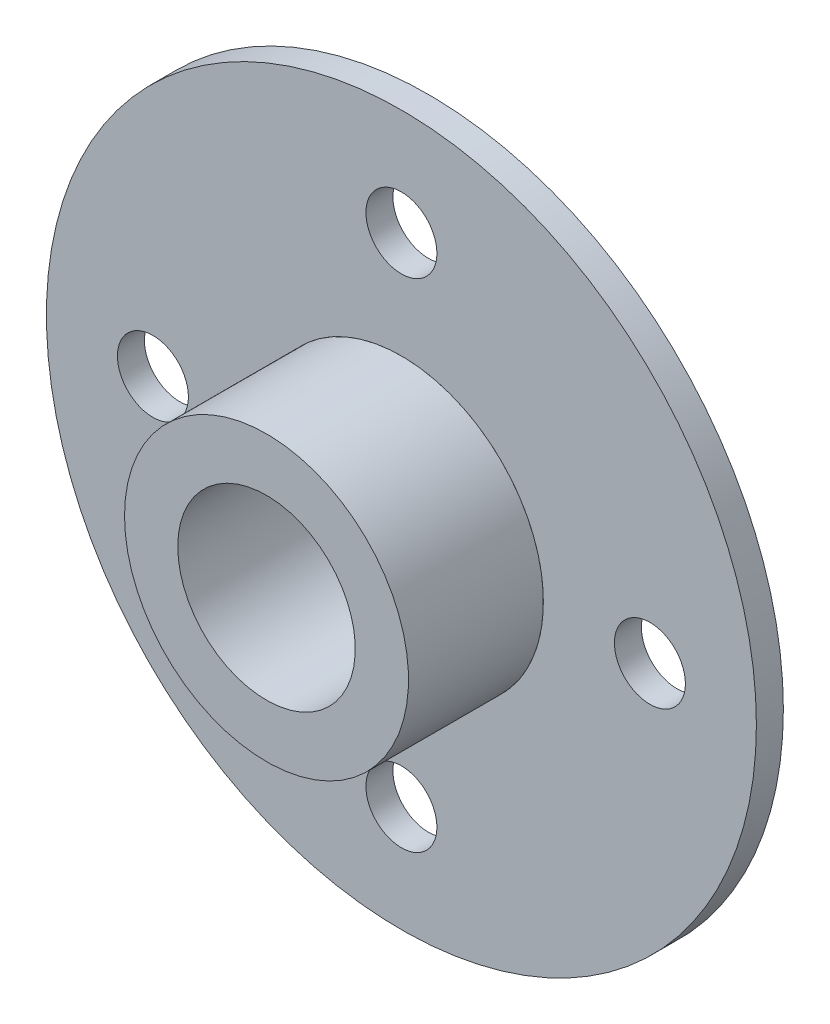
ISO-10303-21;
HEADER;
FILE_DESCRIPTION(('STEP AP214'),'2;1');
FILE_NAME('part.step','',(''),(''),'','','');
FILE_SCHEMA(('AUTOMOTIVE_DESIGN { 1 0 10303 214 1 1 1 1 }'));
ENDSEC;
DATA;
#1=APPLICATION_CONTEXT('core data for automotive mechanical design processes');
#2=APPLICATION_PROTOCOL_DEFINITION('international standard','automotive_design',2000,#1);
#3=PRODUCT_CONTEXT('',#1,'mechanical');
#4=PRODUCT('Part','Part','',(#3));
#5=PRODUCT_RELATED_PRODUCT_CATEGORY('part','',(#4));
#6=PRODUCT_DEFINITION_FORMATION('','',#4);
#7=PRODUCT_DEFINITION_CONTEXT('part definition',#1,'design');
#8=PRODUCT_DEFINITION('design','',#6,#7);
#9=PRODUCT_DEFINITION_SHAPE('','',#8);
#10=(LENGTH_UNIT() NAMED_UNIT(*) SI_UNIT(.MILLI.,.METRE.));
#11=(NAMED_UNIT(*) PLANE_ANGLE_UNIT() SI_UNIT($,.RADIAN.));
#12=(NAMED_UNIT(*) SI_UNIT($,.STERADIAN.) SOLID_ANGLE_UNIT());
#13=UNCERTAINTY_MEASURE_WITH_UNIT(LENGTH_MEASURE(1.E-05),#10,'distance_accuracy_value','');
#14=(GEOMETRIC_REPRESENTATION_CONTEXT(3) GLOBAL_UNCERTAINTY_ASSIGNED_CONTEXT((#13)) GLOBAL_UNIT_ASSIGNED_CONTEXT((#10,
#11,#12)) REPRESENTATION_CONTEXT('',''));
#15=CARTESIAN_POINT('',(0.,0.,0.));
#16=DIRECTION('',(0.,0.,1.));
#17=DIRECTION('',(1.,0.,0.));
#18=AXIS2_PLACEMENT_3D('',#15,#16,#17);
#19=CARTESIAN_POINT('',(0.,0.,4.56));
#20=DIRECTION('',(0.,0.,1.));
#21=DIRECTION('',(1.,0.,0.));
#22=AXIS2_PLACEMENT_3D('',#19,#20,#21);
#23=PLANE('',#22);
#24=CARTESIAN_POINT('',(0.,0.,4.56));
#25=DIRECTION('',(0.,0.,1.));
#26=DIRECTION('',(1.,0.,0.));
#27=AXIS2_PLACEMENT_3D('',#24,#25,#26);
#28=CIRCLE('',#27,4.);
#29=CARTESIAN_POINT('',(-4.,0.,4.56));
#30=VERTEX_POINT('',#29);
#31=EDGE_CURVE('E11',#30,#30,#28,.T.);
#32=ORIENTED_EDGE('',*,*,#31,.T.);
#33=EDGE_LOOP('',(#32));
#34=FACE_BOUND('',#33,.T.);
#35=CARTESIAN_POINT('',(0.,0.,4.56));
#36=DIRECTION('',(0.,0.,1.));
#37=DIRECTION('',(1.,0.,0.));
#38=AXIS2_PLACEMENT_3D('',#35,#36,#37);
#39=CIRCLE('',#38,2.5);
#40=CARTESIAN_POINT('',(-2.5,0.,4.56));
#41=VERTEX_POINT('',#40);
#42=EDGE_CURVE('E53',#41,#41,#39,.T.);
#43=ORIENTED_EDGE('',*,*,#42,.F.);
#44=EDGE_LOOP('',(#43));
#45=FACE_BOUND('',#44,.T.);
#46=ADVANCED_FACE('F42',(#34,#45),#23,.T.);
#47=CARTESIAN_POINT('',(0.,0.,0.76));
#48=DIRECTION('',(0.,0.,1.));
#49=DIRECTION('',(1.,0.,0.));
#50=AXIS2_PLACEMENT_3D('',#47,#48,#49);
#51=PLANE('',#50);
#52=CARTESIAN_POINT('',(0.,0.,0.76));
#53=DIRECTION('',(0.,0.,1.));
#54=DIRECTION('',(1.,0.,0.));
#55=AXIS2_PLACEMENT_3D('',#52,#53,#54);
#56=CIRCLE('',#55,4.);
#57=CARTESIAN_POINT('',(-4.,0.,0.76));
#58=VERTEX_POINT('',#57);
#59=EDGE_CURVE('E46',#58,#58,#56,.T.);
#60=ORIENTED_EDGE('',*,*,#59,.F.);
#61=EDGE_LOOP('',(#60));
#62=FACE_BOUND('',#61,.T.);
#63=CARTESIAN_POINT('',(0.,0.,0.76));
#64=DIRECTION('',(0.,0.,1.));
#65=DIRECTION('',(1.,0.,0.));
#66=AXIS2_PLACEMENT_3D('',#63,#64,#65);
#67=CIRCLE('',#66,2.5);
#68=CARTESIAN_POINT('',(-2.5,0.,0.76));
#69=VERTEX_POINT('',#68);
#70=EDGE_CURVE('E55',#69,#69,#67,.T.);
#71=ORIENTED_EDGE('',*,*,#70,.T.);
#72=EDGE_LOOP('',(#71));
#73=FACE_BOUND('',#72,.T.);
#74=ADVANCED_FACE('F65',(#62,#73),#51,.F.);
#75=CARTESIAN_POINT('',(0.,0.,4.56));
#76=DIRECTION('',(0.,0.,-1.));
#77=DIRECTION('',(-1.,0.,0.));
#78=AXIS2_PLACEMENT_3D('',#75,#76,#77);
#79=CYLINDRICAL_SURFACE('',#78,4.);
#80=CARTESIAN_POINT('',(-4.,0.,4.56));
#81=CARTESIAN_POINT('',(-4.,0.,4.52041666666667));
#82=CARTESIAN_POINT('',(-4.,0.,4.48083333333333));
#83=CARTESIAN_POINT('',(-4.,0.,4.40166666666667));
#84=CARTESIAN_POINT('',(-4.,0.,4.36208333333333));
#85=CARTESIAN_POINT('',(-4.,0.,4.28291666666667));
#86=CARTESIAN_POINT('',(-4.,0.,4.24333333333333));
#87=CARTESIAN_POINT('',(-4.,0.,4.16416666666667));
#88=CARTESIAN_POINT('',(-4.,0.,4.12458333333333));
#89=CARTESIAN_POINT('',(-4.,0.,4.04541666666667));
#90=CARTESIAN_POINT('',(-4.,0.,4.00583333333333));
#91=CARTESIAN_POINT('',(-4.,0.,3.92666666666667));
#92=CARTESIAN_POINT('',(-4.,0.,3.88708333333333));
#93=CARTESIAN_POINT('',(-4.,0.,3.80791666666667));
#94=CARTESIAN_POINT('',(-4.,0.,3.76833333333333));
#95=CARTESIAN_POINT('',(-4.,0.,3.68916666666667));
#96=CARTESIAN_POINT('',(-4.,0.,3.64958333333333));
#97=CARTESIAN_POINT('',(-4.,0.,3.57041666666667));
#98=CARTESIAN_POINT('',(-4.,0.,3.53083333333333));
#99=CARTESIAN_POINT('',(-4.,0.,3.45166666666667));
#100=CARTESIAN_POINT('',(-4.,0.,3.41208333333333));
#101=CARTESIAN_POINT('',(-4.,0.,3.33291666666667));
#102=CARTESIAN_POINT('',(-4.,0.,3.29333333333333));
#103=CARTESIAN_POINT('',(-4.,0.,3.21416666666667));
#104=CARTESIAN_POINT('',(-4.,0.,3.17458333333333));
#105=CARTESIAN_POINT('',(-4.,0.,3.09541666666667));
#106=CARTESIAN_POINT('',(-4.,0.,3.05583333333333));
#107=CARTESIAN_POINT('',(-4.,0.,2.97666666666667));
#108=CARTESIAN_POINT('',(-4.,0.,2.93708333333333));
#109=CARTESIAN_POINT('',(-4.,0.,2.85791666666667));
#110=CARTESIAN_POINT('',(-4.,0.,2.81833333333333));
#111=CARTESIAN_POINT('',(-4.,0.,2.73916666666667));
#112=CARTESIAN_POINT('',(-4.,0.,2.69958333333333));
#113=CARTESIAN_POINT('',(-4.,0.,2.62041666666667));
#114=CARTESIAN_POINT('',(-4.,0.,2.58083333333333));
#115=CARTESIAN_POINT('',(-4.,0.,2.50166666666667));
#116=CARTESIAN_POINT('',(-4.,0.,2.46208333333333));
#117=CARTESIAN_POINT('',(-4.,0.,2.38291666666667));
#118=CARTESIAN_POINT('',(-4.,0.,2.34333333333333));
#119=CARTESIAN_POINT('',(-4.,0.,2.26416666666667));
#120=CARTESIAN_POINT('',(-4.,0.,2.22458333333333));
#121=CARTESIAN_POINT('',(-4.,0.,2.14541666666667));
#122=CARTESIAN_POINT('',(-4.,0.,2.10583333333333));
#123=CARTESIAN_POINT('',(-4.,0.,2.02666666666667));
#124=CARTESIAN_POINT('',(-4.,0.,1.98708333333333));
#125=CARTESIAN_POINT('',(-4.,0.,1.90791666666667));
#126=CARTESIAN_POINT('',(-4.,0.,1.86833333333333));
#127=CARTESIAN_POINT('',(-4.,0.,1.78916666666667));
#128=CARTESIAN_POINT('',(-4.,0.,1.74958333333333));
#129=CARTESIAN_POINT('',(-4.,0.,1.67041666666667));
#130=CARTESIAN_POINT('',(-4.,0.,1.63083333333333));
#131=CARTESIAN_POINT('',(-4.,0.,1.55166666666667));
#132=CARTESIAN_POINT('',(-4.,0.,1.51208333333333));
#133=CARTESIAN_POINT('',(-4.,0.,1.43291666666667));
#134=CARTESIAN_POINT('',(-4.,0.,1.39333333333333));
#135=CARTESIAN_POINT('',(-4.,0.,1.31416666666667));
#136=CARTESIAN_POINT('',(-4.,0.,1.27458333333333));
#137=CARTESIAN_POINT('',(-4.,0.,1.19541666666667));
#138=CARTESIAN_POINT('',(-4.,0.,1.15583333333333));
#139=CARTESIAN_POINT('',(-4.,0.,1.07666666666667));
#140=CARTESIAN_POINT('',(-4.,0.,1.03708333333333));
#141=CARTESIAN_POINT('',(-4.,0.,0.957916666666666));
#142=CARTESIAN_POINT('',(-4.,0.,0.918333333333333));
#143=CARTESIAN_POINT('',(-4.,0.,0.839166666666666));
#144=CARTESIAN_POINT('',(-4.,0.,0.799583333333333));
#145=CARTESIAN_POINT('',(-4.,0.,0.76));
#146=B_SPLINE_CURVE_WITH_KNOTS('',3,(#80,#81,#82,#83,#84,#85,#86,#87,#88,#89,#90,#91,#92,#93,
#94,#95,#96,#97,#98,#99,#100,#101,#102,#103,#104,#105,#106,#107,#108,#109,#110,#111,#112,#113,
#114,#115,#116,#117,#118,#119,#120,#121,#122,#123,#124,#125,#126,#127,#128,#129,#130,#131,#132,
#133,#134,#135,#136,#137,#138,#139,#140,#141,#142,#143,#144,#145),.UNSPECIFIED.,.F.,.F.,(4,2,2,
2,2,2,2,2,2,2,2,2,2,2,2,2,2,2,2,2,2,2,2,2,2,2,2,2,2,2,2,2,4),(0.,0.11875,0.2375,0.35625,0.475,
0.59375,0.7125,0.831249999999999,0.95,1.06875,1.1875,1.30625,1.425,1.54375,1.6625,1.78125,1.9,
2.01875,2.1375,2.25625,2.375,2.49375,2.6125,2.73125,2.85,2.96875,3.0875,3.20625,3.325,3.44375,
3.5625,3.68125,3.8),.UNSPECIFIED.);
#147=EDGE_CURVE('BSEAM44',#30,#58,#146,.T.);
#148=ORIENTED_EDGE('',*,*,#31,.F.);
#149=ORIENTED_EDGE('',*,*,#59,.T.);
#150=ORIENTED_EDGE('',*,*,#147,.T.);
#151=ORIENTED_EDGE('',*,*,#147,.F.);
#152=EDGE_LOOP('',(#148,#150,#149,#151));
#153=FACE_BOUND('',#152,.T.);
#154=ADVANCED_FACE('F44',(#153),#79,.T.);
#155=CARTESIAN_POINT('',(0.,0.,4.56));
#156=DIRECTION('',(0.,0.,-1.));
#157=DIRECTION('',(-1.,0.,0.));
#158=AXIS2_PLACEMENT_3D('',#155,#156,#157);
#159=CYLINDRICAL_SURFACE('',#158,2.5);
#160=CARTESIAN_POINT('',(-2.5,0.,4.56));
#161=CARTESIAN_POINT('',(-2.5,0.,4.52041666666667));
#162=CARTESIAN_POINT('',(-2.5,0.,4.48083333333333));
#163=CARTESIAN_POINT('',(-2.5,0.,4.40166666666667));
#164=CARTESIAN_POINT('',(-2.5,0.,4.36208333333333));
#165=CARTESIAN_POINT('',(-2.5,0.,4.28291666666667));
#166=CARTESIAN_POINT('',(-2.5,0.,4.24333333333333));
#167=CARTESIAN_POINT('',(-2.5,0.,4.16416666666667));
#168=CARTESIAN_POINT('',(-2.5,0.,4.12458333333333));
#169=CARTESIAN_POINT('',(-2.5,0.,4.04541666666667));
#170=CARTESIAN_POINT('',(-2.5,0.,4.00583333333333));
#171=CARTESIAN_POINT('',(-2.5,0.,3.92666666666667));
#172=CARTESIAN_POINT('',(-2.5,0.,3.88708333333333));
#173=CARTESIAN_POINT('',(-2.5,0.,3.80791666666667));
#174=CARTESIAN_POINT('',(-2.5,0.,3.76833333333333));
#175=CARTESIAN_POINT('',(-2.5,0.,3.68916666666667));
#176=CARTESIAN_POINT('',(-2.5,0.,3.64958333333333));
#177=CARTESIAN_POINT('',(-2.5,0.,3.57041666666667));
#178=CARTESIAN_POINT('',(-2.5,0.,3.53083333333333));
#179=CARTESIAN_POINT('',(-2.5,0.,3.45166666666667));
#180=CARTESIAN_POINT('',(-2.5,0.,3.41208333333333));
#181=CARTESIAN_POINT('',(-2.5,0.,3.33291666666667));
#182=CARTESIAN_POINT('',(-2.5,0.,3.29333333333333));
#183=CARTESIAN_POINT('',(-2.5,0.,3.21416666666667));
#184=CARTESIAN_POINT('',(-2.5,0.,3.17458333333333));
#185=CARTESIAN_POINT('',(-2.5,0.,3.09541666666667));
#186=CARTESIAN_POINT('',(-2.5,0.,3.05583333333333));
#187=CARTESIAN_POINT('',(-2.5,0.,2.97666666666667));
#188=CARTESIAN_POINT('',(-2.5,0.,2.93708333333333));
#189=CARTESIAN_POINT('',(-2.5,0.,2.85791666666667));
#190=CARTESIAN_POINT('',(-2.5,0.,2.81833333333333));
#191=CARTESIAN_POINT('',(-2.5,0.,2.73916666666667));
#192=CARTESIAN_POINT('',(-2.5,0.,2.69958333333333));
#193=CARTESIAN_POINT('',(-2.5,0.,2.62041666666667));
#194=CARTESIAN_POINT('',(-2.5,0.,2.58083333333333));
#195=CARTESIAN_POINT('',(-2.5,0.,2.50166666666667));
#196=CARTESIAN_POINT('',(-2.5,0.,2.46208333333333));
#197=CARTESIAN_POINT('',(-2.5,0.,2.38291666666667));
#198=CARTESIAN_POINT('',(-2.5,0.,2.34333333333333));
#199=CARTESIAN_POINT('',(-2.5,0.,2.26416666666667));
#200=CARTESIAN_POINT('',(-2.5,0.,2.22458333333333));
#201=CARTESIAN_POINT('',(-2.5,0.,2.14541666666667));
#202=CARTESIAN_POINT('',(-2.5,0.,2.10583333333333));
#203=CARTESIAN_POINT('',(-2.5,0.,2.02666666666667));
#204=CARTESIAN_POINT('',(-2.5,0.,1.98708333333333));
#205=CARTESIAN_POINT('',(-2.5,0.,1.90791666666667));
#206=CARTESIAN_POINT('',(-2.5,0.,1.86833333333333));
#207=CARTESIAN_POINT('',(-2.5,0.,1.78916666666667));
#208=CARTESIAN_POINT('',(-2.5,0.,1.74958333333333));
#209=CARTESIAN_POINT('',(-2.5,0.,1.67041666666667));
#210=CARTESIAN_POINT('',(-2.5,0.,1.63083333333333));
#211=CARTESIAN_POINT('',(-2.5,0.,1.55166666666667));
#212=CARTESIAN_POINT('',(-2.5,0.,1.51208333333333));
#213=CARTESIAN_POINT('',(-2.5,0.,1.43291666666667));
#214=CARTESIAN_POINT('',(-2.5,0.,1.39333333333333));
#215=CARTESIAN_POINT('',(-2.5,0.,1.31416666666667));
#216=CARTESIAN_POINT('',(-2.5,0.,1.27458333333333));
#217=CARTESIAN_POINT('',(-2.5,0.,1.19541666666667));
#218=CARTESIAN_POINT('',(-2.5,0.,1.15583333333333));
#219=CARTESIAN_POINT('',(-2.5,0.,1.07666666666667));
#220=CARTESIAN_POINT('',(-2.5,0.,1.03708333333333));
#221=CARTESIAN_POINT('',(-2.5,0.,0.957916666666666));
#222=CARTESIAN_POINT('',(-2.5,0.,0.918333333333333));
#223=CARTESIAN_POINT('',(-2.5,0.,0.839166666666666));
#224=CARTESIAN_POINT('',(-2.5,0.,0.799583333333333));
#225=CARTESIAN_POINT('',(-2.5,0.,0.76));
#226=B_SPLINE_CURVE_WITH_KNOTS('',3,(#160,#161,#162,#163,#164,#165,#166,#167,#168,#169,#170,
#171,#172,#173,#174,#175,#176,#177,#178,#179,#180,#181,#182,#183,#184,#185,#186,#187,#188,#189,
#190,#191,#192,#193,#194,#195,#196,#197,#198,#199,#200,#201,#202,#203,#204,#205,#206,#207,#208,
#209,#210,#211,#212,#213,#214,#215,#216,#217,#218,#219,#220,#221,#222,#223,#224,#225),
.UNSPECIFIED.,.F.,.F.,(4,2,2,2,2,2,2,2,2,2,2,2,2,2,2,2,2,2,2,2,2,2,2,2,2,2,2,2,2,2,2,2,4),(0.,
0.118750000000001,0.237500000000001,0.356250000000001,0.475000000000001,0.593750000000001,
0.7125,0.83125,0.95,1.06875,1.1875,1.30625,1.425,1.54375,1.6625,1.78125,1.9,2.01875,2.1375,
2.25625,2.375,2.49375,2.6125,2.73125,2.85,2.96875,3.0875,3.20625,3.325,3.44375,3.5625,3.68125,
3.8),.UNSPECIFIED.);
#227=EDGE_CURVE('BSEAM61',#41,#69,#226,.T.);
#228=ORIENTED_EDGE('',*,*,#42,.T.);
#229=ORIENTED_EDGE('',*,*,#70,.F.);
#230=ORIENTED_EDGE('',*,*,#227,.T.);
#231=ORIENTED_EDGE('',*,*,#227,.F.);
#232=EDGE_LOOP('',(#228,#230,#229,#231));
#233=FACE_BOUND('',#232,.T.);
#234=ADVANCED_FACE('F61',(#233),#159,.F.);
#235=CLOSED_SHELL('',(#46,#74,#154,#234));
#236=MANIFOLD_SOLID_BREP('B2',#235);
#237=CARTESIAN_POINT('',(0.,0.,0.76));
#238=DIRECTION('',(0.,0.,1.));
#239=DIRECTION('',(1.,0.,0.));
#240=AXIS2_PLACEMENT_3D('',#237,#238,#239);
#241=PLANE('',#240);
#242=CARTESIAN_POINT('',(-7.,0.,0.76));
#243=DIRECTION('',(0.,0.,1.));
#244=DIRECTION('',(1.,0.,0.));
#245=AXIS2_PLACEMENT_3D('',#242,#243,#244);
#246=CIRCLE('',#245,1.);
#247=CARTESIAN_POINT('',(-6.,0.,0.76));
#248=VERTEX_POINT('',#247);
#249=EDGE_CURVE('E140',#248,#248,#246,.T.);
#250=ORIENTED_EDGE('',*,*,#249,.F.);
#251=EDGE_LOOP('',(#250));
#252=FACE_BOUND('',#251,.T.);
#253=CARTESIAN_POINT('',(0.,7.,0.76));
#254=DIRECTION('',(0.,0.,1.));
#255=DIRECTION('',(1.,0.,0.));
#256=AXIS2_PLACEMENT_3D('',#253,#254,#255);
#257=CIRCLE('',#256,1.);
#258=CARTESIAN_POINT('',(1.00000000000002,7.,0.76));
#259=VERTEX_POINT('',#258);
#260=EDGE_CURVE('E134',#259,#259,#257,.T.);
#261=ORIENTED_EDGE('',*,*,#260,.F.);
#262=EDGE_LOOP('',(#261));
#263=FACE_BOUND('',#262,.T.);
#264=CARTESIAN_POINT('',(7.,0.,0.76));
#265=DIRECTION('',(0.,0.,1.));
#266=DIRECTION('',(1.,0.,0.));
#267=AXIS2_PLACEMENT_3D('',#264,#265,#266);
#268=CIRCLE('',#267,0.999999999999999);
#269=CARTESIAN_POINT('',(8.,0.,0.76));
#270=VERTEX_POINT('',#269);
#271=EDGE_CURVE('E128',#270,#270,#268,.T.);
#272=ORIENTED_EDGE('',*,*,#271,.F.);
#273=EDGE_LOOP('',(#272));
#274=FACE_BOUND('',#273,.T.);
#275=CARTESIAN_POINT('',(0.,-7.,0.76));
#276=DIRECTION('',(0.,0.,1.));
#277=DIRECTION('',(1.,0.,0.));
#278=AXIS2_PLACEMENT_3D('',#275,#276,#277);
#279=CIRCLE('',#278,1.);
#280=CARTESIAN_POINT('',(0.999999999999927,-7.,0.76));
#281=VERTEX_POINT('',#280);
#282=EDGE_CURVE('E122',#281,#281,#279,.T.);
#283=ORIENTED_EDGE('',*,*,#282,.F.);
#284=EDGE_LOOP('',(#283));
#285=FACE_BOUND('',#284,.T.);
#286=CARTESIAN_POINT('',(0.,0.,0.76));
#287=DIRECTION('',(0.,0.,1.));
#288=DIRECTION('',(1.,0.,0.));
#289=AXIS2_PLACEMENT_3D('',#286,#287,#288);
#290=CIRCLE('',#289,10.);
#291=CARTESIAN_POINT('',(10.,0.,0.76));
#292=VERTEX_POINT('',#291);
#293=EDGE_CURVE('E41',#292,#292,#290,.T.);
#294=ORIENTED_EDGE('',*,*,#293,.T.);
#295=EDGE_LOOP('',(#294));
#296=FACE_BOUND('',#295,.T.);
#297=CARTESIAN_POINT('',(0.,0.,0.76));
#298=DIRECTION('',(0.,0.,1.));
#299=DIRECTION('',(1.,0.,0.));
#300=AXIS2_PLACEMENT_3D('',#297,#298,#299);
#301=CIRCLE('',#300,4.);
#302=CARTESIAN_POINT('',(4.,0.,0.76));
#303=VERTEX_POINT('',#302);
#304=EDGE_CURVE('E114',#303,#303,#301,.T.);
#305=ORIENTED_EDGE('',*,*,#304,.F.);
#306=EDGE_LOOP('',(#305));
#307=FACE_BOUND('',#306,.T.);
#308=ADVANCED_FACE('F103',(#252,#263,#274,#285,#296,#307),#241,.T.);
#309=CARTESIAN_POINT('',(0.,0.,0.));
#310=DIRECTION('',(0.,0.,1.));
#311=DIRECTION('',(1.,0.,0.));
#312=AXIS2_PLACEMENT_3D('',#309,#310,#311);
#313=PLANE('',#312);
#314=CARTESIAN_POINT('',(-7.,0.,0.));
#315=DIRECTION('',(0.,0.,1.));
#316=DIRECTION('',(1.,0.,0.));
#317=AXIS2_PLACEMENT_3D('',#314,#315,#316);
#318=CIRCLE('',#317,1.);
#319=CARTESIAN_POINT('',(-6.,0.,0.));
#320=VERTEX_POINT('',#319);
#321=EDGE_CURVE('E119',#320,#320,#318,.T.);
#322=ORIENTED_EDGE('',*,*,#321,.T.);
#323=EDGE_LOOP('',(#322));
#324=FACE_BOUND('',#323,.T.);
#325=CARTESIAN_POINT('',(0.,7.,0.));
#326=DIRECTION('',(0.,0.,1.));
#327=DIRECTION('',(1.,0.,0.));
#328=AXIS2_PLACEMENT_3D('',#325,#326,#327);
#329=CIRCLE('',#328,1.);
#330=CARTESIAN_POINT('',(1.00000000000002,7.,0.));
#331=VERTEX_POINT('',#330);
#332=EDGE_CURVE('E137',#331,#331,#329,.T.);
#333=ORIENTED_EDGE('',*,*,#332,.T.);
#334=EDGE_LOOP('',(#333));
#335=FACE_BOUND('',#334,.T.);
#336=CARTESIAN_POINT('',(7.,0.,0.));
#337=DIRECTION('',(0.,0.,1.));
#338=DIRECTION('',(1.,0.,0.));
#339=AXIS2_PLACEMENT_3D('',#336,#337,#338);
#340=CIRCLE('',#339,0.999999999999999);
#341=CARTESIAN_POINT('',(8.,0.,0.));
#342=VERTEX_POINT('',#341);
#343=EDGE_CURVE('E131',#342,#342,#340,.T.);
#344=ORIENTED_EDGE('',*,*,#343,.T.);
#345=EDGE_LOOP('',(#344));
#346=FACE_BOUND('',#345,.T.);
#347=CARTESIAN_POINT('',(0.,-7.,0.));
#348=DIRECTION('',(0.,0.,1.));
#349=DIRECTION('',(1.,0.,0.));
#350=AXIS2_PLACEMENT_3D('',#347,#348,#349);
#351=CIRCLE('',#350,1.);
#352=CARTESIAN_POINT('',(0.999999999999927,-7.,0.));
#353=VERTEX_POINT('',#352);
#354=EDGE_CURVE('E125',#353,#353,#351,.T.);
#355=ORIENTED_EDGE('',*,*,#354,.T.);
#356=EDGE_LOOP('',(#355));
#357=FACE_BOUND('',#356,.T.);
#358=CARTESIAN_POINT('',(0.,0.,0.));
#359=DIRECTION('',(0.,0.,1.));
#360=DIRECTION('',(1.,0.,0.));
#361=AXIS2_PLACEMENT_3D('',#358,#359,#360);
#362=CIRCLE('',#361,10.);
#363=CARTESIAN_POINT('',(10.,0.,0.));
#364=VERTEX_POINT('',#363);
#365=EDGE_CURVE('E107',#364,#364,#362,.T.);
#366=ORIENTED_EDGE('',*,*,#365,.F.);
#367=EDGE_LOOP('',(#366));
#368=FACE_BOUND('',#367,.T.);
#369=CARTESIAN_POINT('',(0.,0.,0.));
#370=DIRECTION('',(0.,0.,1.));
#371=DIRECTION('',(1.,0.,0.));
#372=AXIS2_PLACEMENT_3D('',#369,#370,#371);
#373=CIRCLE('',#372,4.);
#374=CARTESIAN_POINT('',(4.,0.,0.));
#375=VERTEX_POINT('',#374);
#376=EDGE_CURVE('E116',#375,#375,#373,.T.);
#377=ORIENTED_EDGE('',*,*,#376,.T.);
#378=EDGE_LOOP('',(#377));
#379=FACE_BOUND('',#378,.T.);
#380=ADVANCED_FACE('F146',(#324,#335,#346,#357,#368,#379),#313,.F.);
#381=CARTESIAN_POINT('',(0.,0.,0.76));
#382=DIRECTION('',(0.,0.,-1.));
#383=DIRECTION('',(-1.,0.,0.));
#384=AXIS2_PLACEMENT_3D('',#381,#382,#383);
#385=CYLINDRICAL_SURFACE('',#384,10.);
#386=ORIENTED_EDGE('',*,*,#293,.F.);
#387=EDGE_LOOP('',(#386));
#388=FACE_BOUND('',#387,.T.);
#389=ORIENTED_EDGE('',*,*,#365,.T.);
#390=EDGE_LOOP('',(#389));
#391=FACE_BOUND('',#390,.T.);
#392=ADVANCED_FACE('F105',(#388,#391),#385,.T.);
#393=CARTESIAN_POINT('',(0.,0.,0.76));
#394=DIRECTION('',(0.,0.,-1.));
#395=DIRECTION('',(-1.,0.,0.));
#396=AXIS2_PLACEMENT_3D('',#393,#394,#395);
#397=CYLINDRICAL_SURFACE('',#396,4.);
#398=ORIENTED_EDGE('',*,*,#304,.T.);
#399=EDGE_LOOP('',(#398));
#400=FACE_BOUND('',#399,.T.);
#401=ORIENTED_EDGE('',*,*,#376,.F.);
#402=EDGE_LOOP('',(#401));
#403=FACE_BOUND('',#402,.T.);
#404=ADVANCED_FACE('F167',(#400,#403),#397,.F.);
#405=CARTESIAN_POINT('',(0.,-7.,0.));
#406=DIRECTION('',(0.,0.,1.));
#407=DIRECTION('',(1.,0.,0.));
#408=AXIS2_PLACEMENT_3D('',#405,#406,#407);
#409=CYLINDRICAL_SURFACE('',#408,1.);
#410=ORIENTED_EDGE('',*,*,#354,.F.);
#411=EDGE_LOOP('',(#410));
#412=FACE_BOUND('',#411,.T.);
#413=ORIENTED_EDGE('',*,*,#282,.T.);
#414=EDGE_LOOP('',(#413));
#415=FACE_BOUND('',#414,.T.);
#416=ADVANCED_FACE('F170',(#412,#415),#409,.F.);
#417=CARTESIAN_POINT('',(7.,0.,0.));
#418=DIRECTION('',(0.,0.,1.));
#419=DIRECTION('',(1.,0.,0.));
#420=AXIS2_PLACEMENT_3D('',#417,#418,#419);
#421=CYLINDRICAL_SURFACE('',#420,0.999999999999999);
#422=ORIENTED_EDGE('',*,*,#343,.F.);
#423=EDGE_LOOP('',(#422));
#424=FACE_BOUND('',#423,.T.);
#425=ORIENTED_EDGE('',*,*,#271,.T.);
#426=EDGE_LOOP('',(#425));
#427=FACE_BOUND('',#426,.T.);
#428=ADVANCED_FACE('F182',(#424,#427),#421,.F.);
#429=CARTESIAN_POINT('',(0.,7.,0.));
#430=DIRECTION('',(0.,0.,1.));
#431=DIRECTION('',(1.,0.,0.));
#432=AXIS2_PLACEMENT_3D('',#429,#430,#431);
#433=CYLINDRICAL_SURFACE('',#432,1.);
#434=ORIENTED_EDGE('',*,*,#332,.F.);
#435=EDGE_LOOP('',(#434));
#436=FACE_BOUND('',#435,.T.);
#437=ORIENTED_EDGE('',*,*,#260,.T.);
#438=EDGE_LOOP('',(#437));
#439=FACE_BOUND('',#438,.T.);
#440=ADVANCED_FACE('F152',(#436,#439),#433,.F.);
#441=CARTESIAN_POINT('',(-7.,0.,0.));
#442=DIRECTION('',(0.,0.,1.));
#443=DIRECTION('',(1.,0.,0.));
#444=AXIS2_PLACEMENT_3D('',#441,#442,#443);
#445=CYLINDRICAL_SURFACE('',#444,1.);
#446=ORIENTED_EDGE('',*,*,#321,.F.);
#447=EDGE_LOOP('',(#446));
#448=FACE_BOUND('',#447,.T.);
#449=ORIENTED_EDGE('',*,*,#249,.T.);
#450=EDGE_LOOP('',(#449));
#451=FACE_BOUND('',#450,.T.);
#452=ADVANCED_FACE('F149',(#448,#451),#445,.F.);
#453=CLOSED_SHELL('',(#308,#380,#392,#404,#416,#428,#440,#452));
#454=MANIFOLD_SOLID_BREP('B6',#453);
#455=ADVANCED_BREP_SHAPE_REPRESENTATION('',(#18,#236,#454),#14);
#456=SHAPE_DEFINITION_REPRESENTATION(#9,#455);
ENDSEC;
END-ISO-10303-21;
